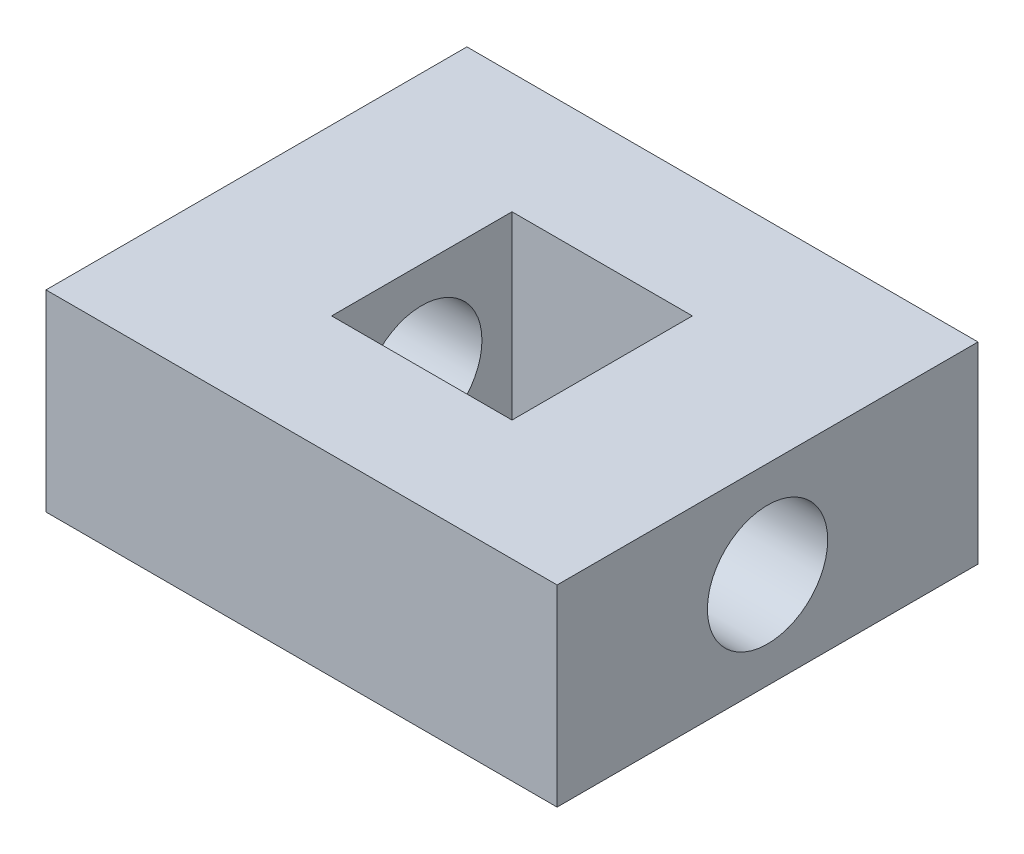
ISO-10303-21;
HEADER;
FILE_DESCRIPTION(('STEP AP214'),'2;1');
FILE_NAME('part.step','',(''),(''),'','','');
FILE_SCHEMA(('AUTOMOTIVE_DESIGN { 1 0 10303 214 1 1 1 1 }'));
ENDSEC;
DATA;
#1=APPLICATION_CONTEXT('core data for automotive mechanical design processes');
#2=APPLICATION_PROTOCOL_DEFINITION('international standard','automotive_design',2000,#1);
#3=PRODUCT_CONTEXT('',#1,'mechanical');
#4=PRODUCT('Part','Part','',(#3));
#5=PRODUCT_RELATED_PRODUCT_CATEGORY('part','',(#4));
#6=PRODUCT_DEFINITION_FORMATION('','',#4);
#7=PRODUCT_DEFINITION_CONTEXT('part definition',#1,'design');
#8=PRODUCT_DEFINITION('design','',#6,#7);
#9=PRODUCT_DEFINITION_SHAPE('','',#8);
#10=(LENGTH_UNIT() NAMED_UNIT(*) SI_UNIT(.MILLI.,.METRE.));
#11=(NAMED_UNIT(*) PLANE_ANGLE_UNIT() SI_UNIT($,.RADIAN.));
#12=(NAMED_UNIT(*) SI_UNIT($,.STERADIAN.) SOLID_ANGLE_UNIT());
#13=UNCERTAINTY_MEASURE_WITH_UNIT(LENGTH_MEASURE(1.E-05),#10,'distance_accuracy_value','');
#14=(GEOMETRIC_REPRESENTATION_CONTEXT(3) GLOBAL_UNCERTAINTY_ASSIGNED_CONTEXT((#13)) GLOBAL_UNIT_ASSIGNED_CONTEXT((#10,
#11,#12)) REPRESENTATION_CONTEXT('',''));
#15=CARTESIAN_POINT('',(0.,0.,0.));
#16=DIRECTION('',(0.,0.,1.));
#17=DIRECTION('',(1.,0.,0.));
#18=AXIS2_PLACEMENT_3D('',#15,#16,#17);
#19=CARTESIAN_POINT('',(0.,3.2,-3.));
#20=DIRECTION('',(0.,0.,-1.));
#21=DIRECTION('',(-1.,0.,0.));
#22=AXIS2_PLACEMENT_3D('',#19,#20,#21);
#23=PLANE('',#22);
#24=DIRECTION('',(1.,0.,0.));
#25=VECTOR('',#24,1.);
#26=CARTESIAN_POINT('',(0.,-3.2,-3.));
#27=LINE('',#26,#25);
#28=CARTESIAN_POINT('',(-3.,-3.2,-3.));
#29=VERTEX_POINT('',#28);
#30=CARTESIAN_POINT('',(3.,-3.2,-3.));
#31=VERTEX_POINT('',#30);
#32=EDGE_CURVE('E147',#29,#31,#27,.T.);
#33=ORIENTED_EDGE('',*,*,#32,.T.);
#34=DIRECTION('',(0.,-1.,0.));
#35=VECTOR('',#34,1.);
#36=CARTESIAN_POINT('',(3.,3.2,-3.));
#37=LINE('',#36,#35);
#38=CARTESIAN_POINT('',(3.,3.2,-3.));
#39=VERTEX_POINT('',#38);
#40=EDGE_CURVE('E11',#39,#31,#37,.T.);
#41=ORIENTED_EDGE('',*,*,#40,.F.);
#42=DIRECTION('',(1.,0.,0.));
#43=VECTOR('',#42,1.);
#44=CARTESIAN_POINT('',(0.,3.2,-3.));
#45=LINE('',#44,#43);
#46=CARTESIAN_POINT('',(-3.,3.2,-3.));
#47=VERTEX_POINT('',#46);
#48=EDGE_CURVE('E118',#47,#39,#45,.T.);
#49=ORIENTED_EDGE('',*,*,#48,.F.);
#50=DIRECTION('',(0.,-1.,0.));
#51=VECTOR('',#50,1.);
#52=CARTESIAN_POINT('',(-3.,3.2,-3.));
#53=LINE('',#52,#51);
#54=EDGE_CURVE('E57',#47,#29,#53,.T.);
#55=ORIENTED_EDGE('',*,*,#54,.T.);
#56=EDGE_LOOP('',(#33,#41,#49,#55));
#57=FACE_BOUND('',#56,.T.);
#58=ADVANCED_FACE('F38',(#57),#23,.F.);
#59=CARTESIAN_POINT('',(3.,3.2,0.));
#60=DIRECTION('',(1.,0.,0.));
#61=DIRECTION('',(0.,0.,-1.));
#62=AXIS2_PLACEMENT_3D('',#59,#60,#61);
#63=PLANE('',#62);
#64=CARTESIAN_POINT('',(3.,0.,0.));
#65=DIRECTION('',(1.,0.,0.));
#66=DIRECTION('',(0.,0.,-1.));
#67=AXIS2_PLACEMENT_3D('',#64,#65,#66);
#68=CIRCLE('',#67,2.);
#69=CARTESIAN_POINT('',(3.,0.,-2.));
#70=VERTEX_POINT('',#69);
#71=EDGE_CURVE('E139',#70,#70,#68,.T.);
#72=ORIENTED_EDGE('',*,*,#71,.T.);
#73=EDGE_LOOP('',(#72));
#74=FACE_BOUND('',#73,.T.);
#75=DIRECTION('',(0.,0.,1.));
#76=VECTOR('',#75,1.);
#77=CARTESIAN_POINT('',(3.,-3.2,0.));
#78=LINE('',#77,#76);
#79=CARTESIAN_POINT('',(3.,-3.2,3.));
#80=VERTEX_POINT('',#79);
#81=EDGE_CURVE('E124',#31,#80,#78,.T.);
#82=ORIENTED_EDGE('',*,*,#81,.T.);
#83=DIRECTION('',(0.,-1.,0.));
#84=VECTOR('',#83,1.);
#85=CARTESIAN_POINT('',(3.,3.2,3.));
#86=LINE('',#85,#84);
#87=CARTESIAN_POINT('',(3.,3.2,3.));
#88=VERTEX_POINT('',#87);
#89=EDGE_CURVE('E48',#88,#80,#86,.T.);
#90=ORIENTED_EDGE('',*,*,#89,.F.);
#91=DIRECTION('',(0.,0.,1.));
#92=VECTOR('',#91,1.);
#93=CARTESIAN_POINT('',(3.,3.2,0.));
#94=LINE('',#93,#92);
#95=EDGE_CURVE('E112',#39,#88,#94,.T.);
#96=ORIENTED_EDGE('',*,*,#95,.F.);
#97=ORIENTED_EDGE('',*,*,#40,.T.);
#98=EDGE_LOOP('',(#82,#90,#96,#97));
#99=FACE_BOUND('',#98,.T.);
#100=ADVANCED_FACE('F123',(#74,#99),#63,.F.);
#101=CARTESIAN_POINT('',(0.,3.2,3.));
#102=DIRECTION('',(0.,0.,-1.));
#103=DIRECTION('',(-1.,0.,0.));
#104=AXIS2_PLACEMENT_3D('',#101,#102,#103);
#105=PLANE('',#104);
#106=DIRECTION('',(1.,0.,0.));
#107=VECTOR('',#106,1.);
#108=CARTESIAN_POINT('',(0.,-3.2,3.));
#109=LINE('',#108,#107);
#110=CARTESIAN_POINT('',(-3.,-3.2,3.));
#111=VERTEX_POINT('',#110);
#112=EDGE_CURVE('E150',#111,#80,#109,.T.);
#113=ORIENTED_EDGE('',*,*,#112,.F.);
#114=DIRECTION('',(0.,-1.,0.));
#115=VECTOR('',#114,1.);
#116=CARTESIAN_POINT('',(-3.,3.2,3.));
#117=LINE('',#116,#115);
#118=CARTESIAN_POINT('',(-3.,3.2,3.));
#119=VERTEX_POINT('',#118);
#120=EDGE_CURVE('E83',#119,#111,#117,.T.);
#121=ORIENTED_EDGE('',*,*,#120,.F.);
#122=DIRECTION('',(1.,0.,0.));
#123=VECTOR('',#122,1.);
#124=CARTESIAN_POINT('',(0.,3.2,3.));
#125=LINE('',#124,#123);
#126=EDGE_CURVE('E117',#119,#88,#125,.T.);
#127=ORIENTED_EDGE('',*,*,#126,.T.);
#128=ORIENTED_EDGE('',*,*,#89,.T.);
#129=EDGE_LOOP('',(#113,#121,#127,#128));
#130=FACE_BOUND('',#129,.T.);
#131=ADVANCED_FACE('F128',(#130),#105,.T.);
#132=CARTESIAN_POINT('',(8.5,3.2,0.));
#133=DIRECTION('',(1.,0.,0.));
#134=DIRECTION('',(0.,0.,-1.));
#135=AXIS2_PLACEMENT_3D('',#132,#133,#134);
#136=PLANE('',#135);
#137=CARTESIAN_POINT('',(8.5,0.,0.));
#138=DIRECTION('',(1.,0.,0.));
#139=DIRECTION('',(0.,0.,-1.));
#140=AXIS2_PLACEMENT_3D('',#137,#138,#139);
#141=CIRCLE('',#140,2.);
#142=CARTESIAN_POINT('',(8.5,0.,-2.));
#143=VERTEX_POINT('',#142);
#144=EDGE_CURVE('E195',#143,#143,#141,.T.);
#145=ORIENTED_EDGE('',*,*,#144,.F.);
#146=EDGE_LOOP('',(#145));
#147=FACE_BOUND('',#146,.T.);
#148=DIRECTION('',(0.,0.,1.));
#149=VECTOR('',#148,1.);
#150=CARTESIAN_POINT('',(8.5,-3.2,0.));
#151=LINE('',#150,#149);
#152=CARTESIAN_POINT('',(8.5,-3.2,-7.));
#153=VERTEX_POINT('',#152);
#154=CARTESIAN_POINT('',(8.5,-3.2,7.));
#155=VERTEX_POINT('',#154);
#156=EDGE_CURVE('E135',#153,#155,#151,.T.);
#157=ORIENTED_EDGE('',*,*,#156,.F.);
#158=DIRECTION('',(0.,-1.,0.));
#159=VECTOR('',#158,1.);
#160=CARTESIAN_POINT('',(8.5,3.2,-7.));
#161=LINE('',#160,#159);
#162=CARTESIAN_POINT('',(8.5,3.2,-7.));
#163=VERTEX_POINT('',#162);
#164=EDGE_CURVE('E95',#163,#153,#161,.T.);
#165=ORIENTED_EDGE('',*,*,#164,.F.);
#166=DIRECTION('',(0.,0.,1.));
#167=VECTOR('',#166,1.);
#168=CARTESIAN_POINT('',(8.5,3.2,0.));
#169=LINE('',#168,#167);
#170=CARTESIAN_POINT('',(8.5,3.2,7.));
#171=VERTEX_POINT('',#170);
#172=EDGE_CURVE('E155',#163,#171,#169,.T.);
#173=ORIENTED_EDGE('',*,*,#172,.T.);
#174=DIRECTION('',(0.,-1.,0.));
#175=VECTOR('',#174,1.);
#176=CARTESIAN_POINT('',(8.5,3.2,7.));
#177=LINE('',#176,#175);
#178=EDGE_CURVE('E131',#171,#155,#177,.T.);
#179=ORIENTED_EDGE('',*,*,#178,.T.);
#180=EDGE_LOOP('',(#157,#165,#173,#179));
#181=FACE_BOUND('',#180,.T.);
#182=ADVANCED_FACE('F40',(#147,#181),#136,.T.);
#183=CARTESIAN_POINT('',(0.,3.2,-7.));
#184=DIRECTION('',(0.,0.,-1.));
#185=DIRECTION('',(-1.,0.,0.));
#186=AXIS2_PLACEMENT_3D('',#183,#184,#185);
#187=PLANE('',#186);
#188=DIRECTION('',(1.,0.,0.));
#189=VECTOR('',#188,1.);
#190=CARTESIAN_POINT('',(0.,-3.2,-7.));
#191=LINE('',#190,#189);
#192=CARTESIAN_POINT('',(-8.5,-3.2,-7.));
#193=VERTEX_POINT('',#192);
#194=EDGE_CURVE('E138',#193,#153,#191,.T.);
#195=ORIENTED_EDGE('',*,*,#194,.F.);
#196=DIRECTION('',(0.,-1.,0.));
#197=VECTOR('',#196,1.);
#198=CARTESIAN_POINT('',(-8.5,3.2,-7.));
#199=LINE('',#198,#197);
#200=CARTESIAN_POINT('',(-8.5,3.2,-7.));
#201=VERTEX_POINT('',#200);
#202=EDGE_CURVE('E162',#201,#193,#199,.T.);
#203=ORIENTED_EDGE('',*,*,#202,.F.);
#204=DIRECTION('',(1.,0.,0.));
#205=VECTOR('',#204,1.);
#206=CARTESIAN_POINT('',(0.,3.2,-7.));
#207=LINE('',#206,#205);
#208=EDGE_CURVE('E168',#201,#163,#207,.T.);
#209=ORIENTED_EDGE('',*,*,#208,.T.);
#210=ORIENTED_EDGE('',*,*,#164,.T.);
#211=EDGE_LOOP('',(#195,#203,#209,#210));
#212=FACE_BOUND('',#211,.T.);
#213=ADVANCED_FACE('F166',(#212),#187,.T.);
#214=CARTESIAN_POINT('',(-8.5,3.2,0.));
#215=DIRECTION('',(1.,0.,0.));
#216=DIRECTION('',(0.,0.,-1.));
#217=AXIS2_PLACEMENT_3D('',#214,#215,#216);
#218=PLANE('',#217);
#219=CARTESIAN_POINT('',(-8.5,0.,0.));
#220=DIRECTION('',(1.,0.,0.));
#221=DIRECTION('',(0.,0.,-1.));
#222=AXIS2_PLACEMENT_3D('',#219,#220,#221);
#223=CIRCLE('',#222,2.);
#224=CARTESIAN_POINT('',(-8.5,0.,-2.));
#225=VERTEX_POINT('',#224);
#226=EDGE_CURVE('E192',#225,#225,#223,.T.);
#227=ORIENTED_EDGE('',*,*,#226,.T.);
#228=EDGE_LOOP('',(#227));
#229=FACE_BOUND('',#228,.T.);
#230=DIRECTION('',(0.,0.,1.));
#231=VECTOR('',#230,1.);
#232=CARTESIAN_POINT('',(-8.5,-3.2,0.));
#233=LINE('',#232,#231);
#234=CARTESIAN_POINT('',(-8.5,-3.2,7.));
#235=VERTEX_POINT('',#234);
#236=EDGE_CURVE('E142',#193,#235,#233,.T.);
#237=ORIENTED_EDGE('',*,*,#236,.T.);
#238=DIRECTION('',(0.,-1.,0.));
#239=VECTOR('',#238,1.);
#240=CARTESIAN_POINT('',(-8.5,3.2,7.));
#241=LINE('',#240,#239);
#242=CARTESIAN_POINT('',(-8.5,3.2,7.));
#243=VERTEX_POINT('',#242);
#244=EDGE_CURVE('E159',#243,#235,#241,.T.);
#245=ORIENTED_EDGE('',*,*,#244,.F.);
#246=DIRECTION('',(0.,0.,1.));
#247=VECTOR('',#246,1.);
#248=CARTESIAN_POINT('',(-8.5,3.2,0.));
#249=LINE('',#248,#247);
#250=EDGE_CURVE('E184',#201,#243,#249,.T.);
#251=ORIENTED_EDGE('',*,*,#250,.F.);
#252=ORIENTED_EDGE('',*,*,#202,.T.);
#253=EDGE_LOOP('',(#237,#245,#251,#252));
#254=FACE_BOUND('',#253,.T.);
#255=ADVANCED_FACE('F177',(#229,#254),#218,.F.);
#256=CARTESIAN_POINT('',(0.,3.2,7.));
#257=DIRECTION('',(0.,0.,-1.));
#258=DIRECTION('',(-1.,0.,0.));
#259=AXIS2_PLACEMENT_3D('',#256,#257,#258);
#260=PLANE('',#259);
#261=DIRECTION('',(1.,0.,0.));
#262=VECTOR('',#261,1.);
#263=CARTESIAN_POINT('',(0.,-3.2,7.));
#264=LINE('',#263,#262);
#265=EDGE_CURVE('E144',#235,#155,#264,.T.);
#266=ORIENTED_EDGE('',*,*,#265,.T.);
#267=ORIENTED_EDGE('',*,*,#178,.F.);
#268=DIRECTION('',(1.,0.,0.));
#269=VECTOR('',#268,1.);
#270=CARTESIAN_POINT('',(0.,3.2,7.));
#271=LINE('',#270,#269);
#272=EDGE_CURVE('E182',#243,#171,#271,.T.);
#273=ORIENTED_EDGE('',*,*,#272,.F.);
#274=ORIENTED_EDGE('',*,*,#244,.T.);
#275=EDGE_LOOP('',(#266,#267,#273,#274));
#276=FACE_BOUND('',#275,.T.);
#277=ADVANCED_FACE('F181',(#276),#260,.F.);
#278=CARTESIAN_POINT('',(-3.,3.2,0.));
#279=DIRECTION('',(1.,0.,0.));
#280=DIRECTION('',(0.,0.,-1.));
#281=AXIS2_PLACEMENT_3D('',#278,#279,#280);
#282=PLANE('',#281);
#283=CARTESIAN_POINT('',(-3.,0.,0.));
#284=DIRECTION('',(1.,0.,0.));
#285=DIRECTION('',(0.,0.,-1.));
#286=AXIS2_PLACEMENT_3D('',#283,#284,#285);
#287=CIRCLE('',#286,2.);
#288=CARTESIAN_POINT('',(-3.,0.,-2.));
#289=VERTEX_POINT('',#288);
#290=EDGE_CURVE('E42',#289,#289,#287,.T.);
#291=ORIENTED_EDGE('',*,*,#290,.F.);
#292=EDGE_LOOP('',(#291));
#293=FACE_BOUND('',#292,.T.);
#294=DIRECTION('',(0.,0.,1.));
#295=VECTOR('',#294,1.);
#296=CARTESIAN_POINT('',(-3.,-3.2,0.));
#297=LINE('',#296,#295);
#298=EDGE_CURVE('E152',#29,#111,#297,.T.);
#299=ORIENTED_EDGE('',*,*,#298,.F.);
#300=ORIENTED_EDGE('',*,*,#54,.F.);
#301=DIRECTION('',(0.,0.,1.));
#302=VECTOR('',#301,1.);
#303=CARTESIAN_POINT('',(-3.,3.2,0.));
#304=LINE('',#303,#302);
#305=EDGE_CURVE('E129',#47,#119,#304,.T.);
#306=ORIENTED_EDGE('',*,*,#305,.T.);
#307=ORIENTED_EDGE('',*,*,#120,.T.);
#308=EDGE_LOOP('',(#299,#300,#306,#307));
#309=FACE_BOUND('',#308,.T.);
#310=ADVANCED_FACE('F218',(#293,#309),#282,.T.);
#311=CARTESIAN_POINT('',(0.,3.2,0.));
#312=DIRECTION('',(0.,1.,0.));
#313=DIRECTION('',(0.,0.,1.));
#314=AXIS2_PLACEMENT_3D('',#311,#312,#313);
#315=PLANE('',#314);
#316=ORIENTED_EDGE('',*,*,#172,.F.);
#317=ORIENTED_EDGE('',*,*,#208,.F.);
#318=ORIENTED_EDGE('',*,*,#250,.T.);
#319=ORIENTED_EDGE('',*,*,#272,.T.);
#320=EDGE_LOOP('',(#316,#317,#318,#319));
#321=FACE_BOUND('',#320,.T.);
#322=ORIENTED_EDGE('',*,*,#48,.T.);
#323=ORIENTED_EDGE('',*,*,#95,.T.);
#324=ORIENTED_EDGE('',*,*,#126,.F.);
#325=ORIENTED_EDGE('',*,*,#305,.F.);
#326=EDGE_LOOP('',(#322,#323,#324,#325));
#327=FACE_BOUND('',#326,.T.);
#328=ADVANCED_FACE('F114',(#321,#327),#315,.T.);
#329=CARTESIAN_POINT('',(0.,-3.2,0.));
#330=DIRECTION('',(0.,1.,0.));
#331=DIRECTION('',(0.,0.,1.));
#332=AXIS2_PLACEMENT_3D('',#329,#330,#331);
#333=PLANE('',#332);
#334=ORIENTED_EDGE('',*,*,#156,.T.);
#335=ORIENTED_EDGE('',*,*,#265,.F.);
#336=ORIENTED_EDGE('',*,*,#236,.F.);
#337=ORIENTED_EDGE('',*,*,#194,.T.);
#338=EDGE_LOOP('',(#334,#335,#336,#337));
#339=FACE_BOUND('',#338,.T.);
#340=ORIENTED_EDGE('',*,*,#32,.F.);
#341=ORIENTED_EDGE('',*,*,#298,.T.);
#342=ORIENTED_EDGE('',*,*,#112,.T.);
#343=ORIENTED_EDGE('',*,*,#81,.F.);
#344=EDGE_LOOP('',(#340,#341,#342,#343));
#345=FACE_BOUND('',#344,.T.);
#346=ADVANCED_FACE('F173',(#339,#345),#333,.F.);
#347=CARTESIAN_POINT('',(-8.5,0.,0.));
#348=DIRECTION('',(1.,0.,0.));
#349=DIRECTION('',(0.,0.,-1.));
#350=AXIS2_PLACEMENT_3D('',#347,#348,#349);
#351=CYLINDRICAL_SURFACE('',#350,2.);
#352=ORIENTED_EDGE('',*,*,#290,.T.);
#353=EDGE_LOOP('',(#352));
#354=FACE_BOUND('',#353,.T.);
#355=ORIENTED_EDGE('',*,*,#226,.F.);
#356=EDGE_LOOP('',(#355));
#357=FACE_BOUND('',#356,.T.);
#358=ADVANCED_FACE('F225',(#354,#357),#351,.F.);
#359=ORIENTED_EDGE('',*,*,#144,.T.);
#360=EDGE_LOOP('',(#359));
#361=FACE_BOUND('',#360,.T.);
#362=ORIENTED_EDGE('',*,*,#71,.F.);
#363=EDGE_LOOP('',(#362));
#364=FACE_BOUND('',#363,.T.);
#365=ADVANCED_FACE('F199',(#361,#364),#351,.F.);
#366=CLOSED_SHELL('',(#58,#100,#131,#182,#213,#255,#277,#310,#328,#346,#358,#365));
#367=MANIFOLD_SOLID_BREP('B2',#366);
#368=ADVANCED_BREP_SHAPE_REPRESENTATION('',(#18,#367),#14);
#369=SHAPE_DEFINITION_REPRESENTATION(#9,#368);
ENDSEC;
END-ISO-10303-21;
